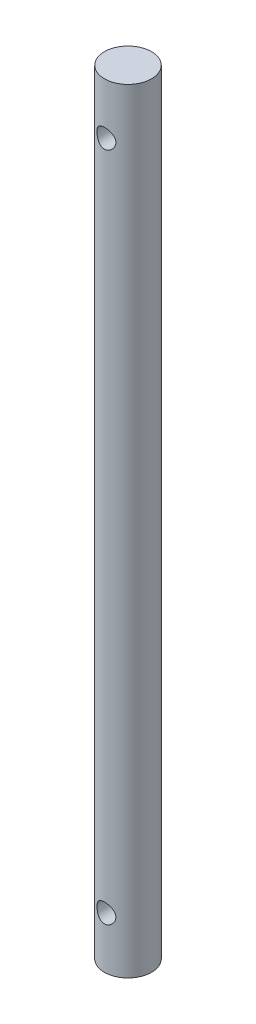
ISO-10303-21;
HEADER;
FILE_DESCRIPTION(('STEP AP214'),'2;1');
FILE_NAME('part.step','',(''),(''),'','','');
FILE_SCHEMA(('AUTOMOTIVE_DESIGN { 1 0 10303 214 1 1 1 1 }'));
ENDSEC;
DATA;
#1=APPLICATION_CONTEXT('core data for automotive mechanical design processes');
#2=APPLICATION_PROTOCOL_DEFINITION('international standard','automotive_design',2000,#1);
#3=PRODUCT_CONTEXT('',#1,'mechanical');
#4=PRODUCT('Part','Part','',(#3));
#5=PRODUCT_RELATED_PRODUCT_CATEGORY('part','',(#4));
#6=PRODUCT_DEFINITION_FORMATION('','',#4);
#7=PRODUCT_DEFINITION_CONTEXT('part definition',#1,'design');
#8=PRODUCT_DEFINITION('design','',#6,#7);
#9=PRODUCT_DEFINITION_SHAPE('','',#8);
#10=(LENGTH_UNIT() NAMED_UNIT(*) SI_UNIT(.MILLI.,.METRE.));
#11=(NAMED_UNIT(*) PLANE_ANGLE_UNIT() SI_UNIT($,.RADIAN.));
#12=(NAMED_UNIT(*) SI_UNIT($,.STERADIAN.) SOLID_ANGLE_UNIT());
#13=UNCERTAINTY_MEASURE_WITH_UNIT(LENGTH_MEASURE(1.E-05),#10,'distance_accuracy_value','');
#14=(GEOMETRIC_REPRESENTATION_CONTEXT(3) GLOBAL_UNCERTAINTY_ASSIGNED_CONTEXT((#13)) GLOBAL_UNIT_ASSIGNED_CONTEXT((#10,
#11,#12)) REPRESENTATION_CONTEXT('',''));
#15=CARTESIAN_POINT('',(0.,0.,0.));
#16=DIRECTION('',(0.,0.,1.));
#17=DIRECTION('',(1.,0.,0.));
#18=AXIS2_PLACEMENT_3D('',#15,#16,#17);
#19=CARTESIAN_POINT('',(0.,65.09,0.));
#20=DIRECTION('',(0.,-1.,0.));
#21=DIRECTION('',(0.,0.,-1.));
#22=AXIS2_PLACEMENT_3D('',#19,#20,#21);
#23=CYLINDRICAL_SURFACE('',#22,3.96);
#24=CARTESIAN_POINT('',(0.,58.02,-3.96));
#25=CARTESIAN_POINT('',(-0.0854312436325381,58.019992025033,-3.95999409172408));
#26=CARTESIAN_POINT('',(-0.171009566426885,58.0130735641593,-3.95720303708857));
#27=CARTESIAN_POINT('',(-0.339752792783413,57.9856398631795,-3.94631023386838));
#28=CARTESIAN_POINT('',(-0.422910519502968,57.9650877890048,-3.93819409911361));
#29=CARTESIAN_POINT('',(-0.584099444114652,57.9112561964,-3.91752553807651));
#30=CARTESIAN_POINT('',(-0.662146503104793,57.8780184787158,-3.90498769207319));
#31=CARTESIAN_POINT('',(-0.811485485023458,57.7999255873628,-3.87670934376557));
#32=CARTESIAN_POINT('',(-0.882779714464923,57.7550744001049,-3.86096994081656));
#33=CARTESIAN_POINT('',(-1.0200714781108,57.6527816382026,-3.82704452603687));
#34=CARTESIAN_POINT('',(-1.08570711965203,57.5948798441887,-3.80878219199709));
#35=CARTESIAN_POINT('',(-1.20664287587372,57.4691009866328,-3.77221586273226));
#36=CARTESIAN_POINT('',(-1.26193790039142,57.4012190395782,-3.75391185145518));
#37=CARTESIAN_POINT('',(-1.36306969491331,57.2537044101543,-3.71841985760219));
#38=CARTESIAN_POINT('',(-1.40837003993839,57.1736808630508,-3.70131893821813));
#39=CARTESIAN_POINT('',(-1.48470612668735,57.0063609178797,-3.67136783703444));
#40=CARTESIAN_POINT('',(-1.51574869497597,56.919068024046,-3.65851562180059));
#41=CARTESIAN_POINT('',(-1.56122167318534,56.7438462926132,-3.63933707896309));
#42=CARTESIAN_POINT('',(-1.57634523260308,56.6561280820495,-3.63273982388139));
#43=CARTESIAN_POINT('',(-1.59171584697393,56.4791699467331,-3.62603341880269));
#44=CARTESIAN_POINT('',(-1.59197029417087,56.3899308001947,-3.62592104481919));
#45=CARTESIAN_POINT('',(-1.57812046956369,56.219146496992,-3.63196614567175));
#46=CARTESIAN_POINT('',(-1.56502317808247,56.1375010814797,-3.63768392079308));
#47=CARTESIAN_POINT('',(-1.52652158572633,55.9776828510755,-3.65400662325502));
#48=CARTESIAN_POINT('',(-1.50111511926502,55.8995106498785,-3.6646124105408));
#49=CARTESIAN_POINT('',(-1.43823154522724,55.7469638572439,-3.68974965277596));
#50=CARTESIAN_POINT('',(-1.40051775207702,55.6726999143918,-3.7043570997677));
#51=CARTESIAN_POINT('',(-1.31425635567717,55.5312802946682,-3.73583117344958));
#52=CARTESIAN_POINT('',(-1.26570466419811,55.4641273142966,-3.75269865169747));
#53=CARTESIAN_POINT('',(-1.15469818714458,55.3333278744793,-3.78839332137411));
#54=CARTESIAN_POINT('',(-1.09145471692521,55.2703626695358,-3.80727078769127));
#55=CARTESIAN_POINT('',(-0.955106321970933,55.1557129449352,-3.84374142720701));
#56=CARTESIAN_POINT('',(-0.881999408277215,55.1040307060004,-3.86133434027042));
#57=CARTESIAN_POINT('',(-0.726054695745388,55.0125107091761,-3.89370041888039));
#58=CARTESIAN_POINT('',(-0.643051229377972,54.9729311121925,-3.90841000074766));
#59=CARTESIAN_POINT('',(-0.470823689417729,54.9085318851767,-3.93287067816593));
#60=CARTESIAN_POINT('',(-0.381602826870437,54.8837046982959,-3.94262431200497));
#61=CARTESIAN_POINT('',(-0.205181951129866,54.8508971324546,-3.95561046973272));
#62=CARTESIAN_POINT('',(-0.118178130229558,54.8420013446021,-3.9591968236783));
#63=CARTESIAN_POINT('',(0.0561447509033511,54.8386037660573,-3.96056023468678));
#64=CARTESIAN_POINT('',(0.143463722686201,54.8440982093446,-3.95833881168432));
#65=CARTESIAN_POINT('',(0.311776688751577,54.8686535997764,-3.94856768844801));
#66=CARTESIAN_POINT('',(0.392877945215572,54.8870880643155,-3.94126417127798));
#67=CARTESIAN_POINT('',(0.550760137857933,54.936146029501,-3.92231943736234));
#68=CARTESIAN_POINT('',(0.627540518322281,54.966771093927,-3.91067766412828));
#69=CARTESIAN_POINT('',(0.77724935783678,55.0403405691312,-3.88374155370206));
#70=CARTESIAN_POINT('',(0.849987696591288,55.0836337122056,-3.86834622611552));
#71=CARTESIAN_POINT('',(0.987423138726882,55.1809238540338,-3.83556975401489));
#72=CARTESIAN_POINT('',(1.05211698899502,55.2349251603082,-3.81818781155081));
#73=CARTESIAN_POINT('',(1.17614195894536,55.3563101924046,-3.78189637459643));
#74=CARTESIAN_POINT('',(1.23483018041225,55.4243451236288,-3.76296217553955));
#75=CARTESIAN_POINT('',(1.34011648876367,55.5696297824719,-3.72676743613199));
#76=CARTESIAN_POINT('',(1.38671251995656,55.6468810736325,-3.70950718066632));
#77=CARTESIAN_POINT('',(1.46680418211759,55.8096079188738,-3.6785807182313));
#78=CARTESIAN_POINT('',(1.5001631360796,55.8951584723045,-3.66495246228337));
#79=CARTESIAN_POINT('',(1.55174097838182,56.0713756378136,-3.64341816688347));
#80=CARTESIAN_POINT('',(1.56997115659847,56.1620383808538,-3.63550786097046));
#81=CARTESIAN_POINT('',(1.58969165930686,56.3388307267036,-3.62692505662655));
#82=CARTESIAN_POINT('',(1.59229874657574,56.4248130797111,-3.62576985121696));
#83=CARTESIAN_POINT('',(1.58363602102753,56.5959300465178,-3.6295618677272));
#84=CARTESIAN_POINT('',(1.57236800062636,56.6810647683836,-3.63450830142446));
#85=CARTESIAN_POINT('',(1.53718935530539,56.8445659102567,-3.64951905553429));
#86=CARTESIAN_POINT('',(1.51380447273074,56.9230668386092,-3.65936992820412));
#87=CARTESIAN_POINT('',(1.45554973408757,57.0750612722897,-3.682927777119));
#88=CARTESIAN_POINT('',(1.42067670095013,57.1485533856277,-3.69663581991833));
#89=CARTESIAN_POINT('',(1.33811819131313,57.293051018305,-3.72734263685481));
#90=CARTESIAN_POINT('',(1.28981103398286,57.3636702466382,-3.74448535729744));
#91=CARTESIAN_POINT('',(1.18266085686363,57.496150433226,-3.77969451476588));
#92=CARTESIAN_POINT('',(1.12381461759375,57.5580087048121,-3.79776123284642));
#93=CARTESIAN_POINT('',(0.992666920972371,57.6753721495081,-3.83420598645991));
#94=CARTESIAN_POINT('',(0.919736394022115,57.7301952587485,-3.85252682455425));
#95=CARTESIAN_POINT('',(0.765017524570699,57.8268409347584,-3.88620719499887));
#96=CARTESIAN_POINT('',(0.683225096276019,57.8686574701399,-3.90156535224942));
#97=CARTESIAN_POINT('',(0.514584606819031,57.9371284351909,-3.92733331338059));
#98=CARTESIAN_POINT('',(0.427857759377116,57.964048531392,-3.9378292379452));
#99=CARTESIAN_POINT('',(0.25076512452607,58.0026975538503,-3.9530434204857));
#100=CARTESIAN_POINT('',(0.160411818463733,58.0144746322737,-3.95777998958768));
#101=CARTESIAN_POINT('',(0.0465699177516872,58.0194907424783,-3.95979622191286));
#102=CARTESIAN_POINT('',(0.0232904245344727,58.0200021741503,-3.96000161072517));
#103=CARTESIAN_POINT('',(0.,58.02,-3.96));
#104=B_SPLINE_CURVE_WITH_KNOTS('',3,(#24,#25,#26,#27,#28,#29,#30,#31,#32,#33,#34,#35,#36,#37,
#38,#39,#40,#41,#42,#43,#44,#45,#46,#47,#48,#49,#50,#51,#52,#53,#54,#55,#56,#57,#58,#59,#60,#61,
#62,#63,#64,#65,#66,#67,#68,#69,#70,#71,#72,#73,#74,#75,#76,#77,#78,#79,#80,#81,#82,#83,#84,#85,
#86,#87,#88,#89,#90,#91,#92,#93,#94,#95,#96,#97,#98,#99,#100,#101,#102,#103),.UNSPECIFIED.,.T.,
.F.,(4,2,2,2,2,2,2,2,2,2,2,2,2,2,2,2,2,2,2,2,2,2,2,2,2,2,2,2,2,2,2,2,2,2,2,2,2,2,2,4),(0.,
0.256231140189331,0.513157377427788,0.769244220124074,1.02524327534304,1.29230201007723,
1.55949186026509,1.83868361055381,2.11774154527388,2.38407071723505,2.65026748136253,
2.89777254590575,3.14532117050418,3.39794262283324,3.65065952955054,3.923073659252,
4.19554280346823,4.47347304846089,4.75126080206307,5.01250182072127,5.27367447767637,
5.5230040379708,5.77236559195324,6.02936802878935,6.2864740592384,6.5606810322328,
6.83493459035823,7.11195048564655,7.3887594709515,7.64552050473718,7.90224837306562,
8.1486690444067,8.39515792112244,8.65582731056964,8.91657646560165,9.19441458130436,
9.47238134423982,9.74521635192218,10.0171816285484,10.0870358385565),.UNSPECIFIED.);
#105=CARTESIAN_POINT('',(0.,58.02,-3.96));
#106=VERTEX_POINT('',#105);
#107=EDGE_CURVE('E49',#106,#106,#104,.T.);
#108=ORIENTED_EDGE('',*,*,#107,.T.);
#109=EDGE_LOOP('',(#108));
#110=FACE_BOUND('',#109,.T.);
#111=CARTESIAN_POINT('',(1.59,56.43,3.62677542729075));
#112=CARTESIAN_POINT('',(1.58999195078685,56.3448836991205,3.62678298759535));
#113=CARTESIAN_POINT('',(1.58312219250491,56.2596163126124,3.62981507705667));
#114=CARTESIAN_POINT('',(1.55590022664081,56.0915237518945,3.64156293360954));
#115=CARTESIAN_POINT('',(1.53551023960798,56.0087061022851,3.65029462598056));
#116=CARTESIAN_POINT('',(1.48215152891577,55.8482397695235,3.6722812537767));
#117=CARTESIAN_POINT('',(1.44923159281701,55.7705723930677,3.68551862467545));
#118=CARTESIAN_POINT('',(1.37188989980722,55.6218876516628,3.71499983925612));
#119=CARTESIAN_POINT('',(1.32747143757207,55.5508683897516,3.73124282135984));
#120=CARTESIAN_POINT('',(1.22565191327523,55.413352087321,3.76595452485308));
#121=CARTESIAN_POINT('',(1.16769340941828,55.3472857444371,3.78449521993051));
#122=CARTESIAN_POINT('',(1.0416113765069,55.2254949033661,3.82111930885842));
#123=CARTESIAN_POINT('',(0.973484104794366,55.1697742299618,3.83920253145625));
#124=CARTESIAN_POINT('',(0.825668950713796,55.0681159104682,3.87373830208315));
#125=CARTESIAN_POINT('',(0.74562904007728,55.0226555042832,3.89009738856802));
#126=CARTESIAN_POINT('',(0.578263574542512,54.9460284713871,3.91846895609392));
#127=CARTESIAN_POINT('',(0.490941053207268,54.9148559278861,3.93048323594027));
#128=CARTESIAN_POINT('',(0.316003617767931,54.869227834353,3.94830218011608));
#129=CARTESIAN_POINT('',(0.228610380252791,54.8540315774747,3.95438095044113));
#130=CARTESIAN_POINT('',(0.0523170355787117,54.8384015657415,3.96063514526383));
#131=CARTESIAN_POINT('',(-0.0365824935813495,54.8379622711463,3.96081278503627));
#132=CARTESIAN_POINT('',(-0.208007720908716,54.8514541926005,3.95541101049953));
#133=CARTESIAN_POINT('',(-0.290609423787398,54.8645736036623,3.95015681283276));
#134=CARTESIAN_POINT('',(-0.45232424868461,54.9034287316185,3.93492083798518));
#135=CARTESIAN_POINT('',(-0.531437114289664,54.9291653741426,3.92493871395443));
#136=CARTESIAN_POINT('',(-0.685356914161423,54.9928397420274,3.90103175818298));
#137=CARTESIAN_POINT('',(-0.760080831602969,55.0309557651151,3.88704969002319));
#138=CARTESIAN_POINT('',(-0.902265063681879,55.1181391962909,3.85652869017187));
#139=CARTESIAN_POINT('',(-0.969722869177601,55.167210369564,3.83998888000983));
#140=CARTESIAN_POINT('',(-1.10019371649987,55.2786903505805,3.804738993193));
#141=CARTESIAN_POINT('',(-1.16261832431589,55.3417663213104,3.78595772770334));
#142=CARTESIAN_POINT('',(-1.27624601729864,55.4775620429016,3.74918266451347));
#143=CARTESIAN_POINT('',(-1.32744537260277,55.5502849863598,3.73118913014062));
#144=CARTESIAN_POINT('',(-1.41852965971939,55.705960878874,3.69754046729277));
#145=CARTESIAN_POINT('',(-1.45804845557621,55.7891472045952,3.68196709232658));
#146=CARTESIAN_POINT('',(-1.52228214928927,55.9617858441893,3.65588201320998));
#147=CARTESIAN_POINT('',(-1.54700674892019,56.0512340085676,3.6453669927683));
#148=CARTESIAN_POINT('',(-1.57951296663874,56.2279847761902,3.63139570717007));
#149=CARTESIAN_POINT('',(-1.58824227796941,56.3150815162165,3.62754542476669));
#150=CARTESIAN_POINT('',(-1.59127586215782,56.4895614608864,3.62621666083514));
#151=CARTESIAN_POINT('',(-1.58558456180527,56.5769445693972,3.62873622391322));
#152=CARTESIAN_POINT('',(-1.56080153217723,56.7442264516949,3.63945863715613));
#153=CARTESIAN_POINT('',(-1.5425001671102,56.824266477251,3.64732593338939));
#154=CARTESIAN_POINT('',(-1.49404381769741,56.9800854856913,3.6674399981933));
#155=CARTESIAN_POINT('',(-1.46388619200505,57.0558635147818,3.67968774258854));
#156=CARTESIAN_POINT('',(-1.39120293990302,57.2044497022671,3.70779274404468));
#157=CARTESIAN_POINT('',(-1.3482236341883,57.2770112239548,3.72377668785942));
#158=CARTESIAN_POINT('',(-1.25157971766847,57.414224024757,3.7573610951886));
#159=CARTESIAN_POINT('',(-1.19791073103539,57.4788720469197,3.77496221910202));
#160=CARTESIAN_POINT('',(-1.07668918121796,57.6034316585069,3.81138175144335));
#161=CARTESIAN_POINT('',(-1.00839997921708,57.6626311103257,3.83019311186344));
#162=CARTESIAN_POINT('',(-0.862408571448087,57.7688422740752,3.86568080642493));
#163=CARTESIAN_POINT('',(-0.784705953968486,57.8158534526488,3.88235704711762));
#164=CARTESIAN_POINT('',(-0.621796205927506,57.8961899681781,3.91175301589417));
#165=CARTESIAN_POINT('',(-0.536589132941812,57.9295154101224,3.92447277432956));
#166=CARTESIAN_POINT('',(-0.361141335505479,57.981136982049,3.94448395625395));
#167=CARTESIAN_POINT('',(-0.270903398374161,57.9994413477079,3.95177835412537));
#168=CARTESIAN_POINT('',(-0.0943465402302836,58.01951866011,3.95979718360758));
#169=CARTESIAN_POINT('',(-0.00815938553605542,58.0222982378463,3.96092158806393));
#170=CARTESIAN_POINT('',(0.163412317398946,58.0139096470454,3.9575565819137));
#171=CARTESIAN_POINT('',(0.248796987211363,58.0027436266517,3.95306803591116));
#172=CARTESIAN_POINT('',(0.413613134601732,57.9675006707753,3.93918253154566));
#173=CARTESIAN_POINT('',(0.493147195417048,57.9438365727284,3.92994275990294));
#174=CARTESIAN_POINT('',(0.647101138369533,57.8847041022224,3.90754623467457));
#175=CARTESIAN_POINT('',(0.721520011998115,57.8492334099876,3.89438871137733));
#176=CARTESIAN_POINT('',(0.866756555331419,57.7657240950058,3.864721299715));
#177=CARTESIAN_POINT('',(0.937268332309587,57.7171980344492,3.84808865595822));
#178=CARTESIAN_POINT('',(1.06943963801552,57.6096872740417,3.813472746772));
#179=CARTESIAN_POINT('',(1.13109617697811,57.5506990568396,3.7954890282903));
#180=CARTESIAN_POINT('',(1.24778992956168,57.4195921091038,3.75880212876852));
#181=CARTESIAN_POINT('',(1.30217553401349,57.346884330995,3.74012391654668));
#182=CARTESIAN_POINT('',(1.39804531442304,57.1927606807914,3.70535843178243));
#183=CARTESIAN_POINT('',(1.4395225223093,57.1113401372217,3.68927256086084));
#184=CARTESIAN_POINT('',(1.50779852377964,56.9426863664309,3.66189731992592));
#185=CARTESIAN_POINT('',(1.53472919862279,56.8555136915351,3.65056507026092));
#186=CARTESIAN_POINT('',(1.57324752767344,56.6774506212119,3.63413674472207));
#187=CARTESIAN_POINT('',(1.58488666518809,56.5865737681358,3.62901974784891));
#188=CARTESIAN_POINT('',(1.58955231843662,56.4736723718772,3.62697069883915));
#189=CARTESIAN_POINT('',(1.5900020654581,56.4518411600909,3.62677348728841));
#190=CARTESIAN_POINT('',(1.59,56.43,3.62677542729075));
#191=B_SPLINE_CURVE_WITH_KNOTS('',3,(#111,#112,#113,#114,#115,#116,#117,#118,#119,#120,#121,
#122,#123,#124,#125,#126,#127,#128,#129,#130,#131,#132,#133,#134,#135,#136,#137,#138,#139,#140,
#141,#142,#143,#144,#145,#146,#147,#148,#149,#150,#151,#152,#153,#154,#155,#156,#157,#158,#159,
#160,#161,#162,#163,#164,#165,#166,#167,#168,#169,#170,#171,#172,#173,#174,#175,#176,#177,#178,
#179,#180,#181,#182,#183,#184,#185,#186,#187,#188,#189,#190),.UNSPECIFIED.,.T.,.F.,(4,2,2,2,2,2,
2,2,2,2,2,2,2,2,2,2,2,2,2,2,2,2,2,2,2,2,2,2,2,2,2,2,2,2,2,2,2,2,2,4),(0.,0.255290060611476,
0.511296499083921,0.766316163095071,1.02126283697459,1.28954166836763,1.55791948551856,
1.83697140859004,2.11590766798773,2.38124911057845,2.64649094329843,2.8967230259443,
3.14697346895015,3.40100115122495,3.65511627527115,3.92602646568736,4.19702653662425,
4.4757898492809,4.75437015291681,5.0158335070881,5.27721660786416,5.52355116179761,
5.7699406254532,6.02636454041952,6.28289363921607,6.55854237922545,6.83420317954946,
7.1098618651328,7.38536931285348,7.64278513845774,7.90016131729304,8.14952348564654,
8.39893467796963,8.6594024442466,8.91995794571119,9.19674456629126,9.47368034071757,
9.74806133040632,10.021516150881,10.0870245320703),.UNSPECIFIED.);
#192=CARTESIAN_POINT('',(1.59,56.43,3.62677542729075));
#193=VERTEX_POINT('',#192);
#194=EDGE_CURVE('E53',#193,#193,#191,.T.);
#195=ORIENTED_EDGE('',*,*,#194,.T.);
#196=EDGE_LOOP('',(#195));
#197=FACE_BOUND('',#196,.T.);
#198=CARTESIAN_POINT('',(0.,65.09,0.));
#199=DIRECTION('',(0.,1.,0.));
#200=DIRECTION('',(0.,0.,1.));
#201=AXIS2_PLACEMENT_3D('',#198,#199,#200);
#202=CIRCLE('',#201,3.96);
#203=CARTESIAN_POINT('',(0.,65.09,3.96));
#204=VERTEX_POINT('',#203);
#205=EDGE_CURVE('E80',#204,#204,#202,.T.);
#206=ORIENTED_EDGE('',*,*,#205,.F.);
#207=EDGE_LOOP('',(#206));
#208=FACE_BOUND('',#207,.T.);
#209=CARTESIAN_POINT('',(0.,-65.09,0.));
#210=DIRECTION('',(0.,1.,0.));
#211=DIRECTION('',(0.,0.,1.));
#212=AXIS2_PLACEMENT_3D('',#209,#210,#211);
#213=CIRCLE('',#212,3.96);
#214=CARTESIAN_POINT('',(0.,-65.09,3.96));
#215=VERTEX_POINT('',#214);
#216=EDGE_CURVE('E81',#215,#215,#213,.T.);
#217=ORIENTED_EDGE('',*,*,#216,.T.);
#218=EDGE_LOOP('',(#217));
#219=FACE_BOUND('',#218,.T.);
#220=CARTESIAN_POINT('',(1.59,-56.43,3.62677542729075));
#221=CARTESIAN_POINT('',(1.58999195078685,-56.3448836991205,3.62678298759535));
#222=CARTESIAN_POINT('',(1.58312219250491,-56.2596163126124,3.62981507705667));
#223=CARTESIAN_POINT('',(1.55590022664081,-56.0915237518945,3.64156293360954));
#224=CARTESIAN_POINT('',(1.53551023960798,-56.0087061022851,3.65029462598056));
#225=CARTESIAN_POINT('',(1.48215152891577,-55.8482397695235,3.6722812537767));
#226=CARTESIAN_POINT('',(1.44923159281701,-55.7705723930677,3.68551862467545));
#227=CARTESIAN_POINT('',(1.37188989980722,-55.6218876516628,3.71499983925612));
#228=CARTESIAN_POINT('',(1.32747143757207,-55.5508683897516,3.73124282135984));
#229=CARTESIAN_POINT('',(1.22565191327523,-55.413352087321,3.76595452485308));
#230=CARTESIAN_POINT('',(1.16769340941828,-55.3472857444371,3.78449521993051));
#231=CARTESIAN_POINT('',(1.0416113765069,-55.2254949033661,3.82111930885842));
#232=CARTESIAN_POINT('',(0.973484104794366,-55.1697742299618,3.83920253145625));
#233=CARTESIAN_POINT('',(0.825668950713796,-55.0681159104682,3.87373830208315));
#234=CARTESIAN_POINT('',(0.74562904007728,-55.0226555042832,3.89009738856802));
#235=CARTESIAN_POINT('',(0.578263574542512,-54.9460284713871,3.91846895609392));
#236=CARTESIAN_POINT('',(0.490941053207268,-54.9148559278861,3.93048323594027));
#237=CARTESIAN_POINT('',(0.316003617767931,-54.869227834353,3.94830218011608));
#238=CARTESIAN_POINT('',(0.228610380252791,-54.8540315774747,3.95438095044113));
#239=CARTESIAN_POINT('',(0.0523170355787117,-54.8384015657415,3.96063514526383));
#240=CARTESIAN_POINT('',(-0.0365824935813495,-54.8379622711463,3.96081278503627));
#241=CARTESIAN_POINT('',(-0.208007720908716,-54.8514541926005,3.95541101049953));
#242=CARTESIAN_POINT('',(-0.290609423787398,-54.8645736036623,3.95015681283276));
#243=CARTESIAN_POINT('',(-0.45232424868461,-54.9034287316185,3.93492083798518));
#244=CARTESIAN_POINT('',(-0.531437114289664,-54.9291653741426,3.92493871395443));
#245=CARTESIAN_POINT('',(-0.685356914161423,-54.9928397420274,3.90103175818298));
#246=CARTESIAN_POINT('',(-0.760080831602969,-55.0309557651151,3.88704969002319));
#247=CARTESIAN_POINT('',(-0.902265063681879,-55.1181391962909,3.85652869017187));
#248=CARTESIAN_POINT('',(-0.969722869177601,-55.167210369564,3.83998888000983));
#249=CARTESIAN_POINT('',(-1.10019371649987,-55.2786903505805,3.804738993193));
#250=CARTESIAN_POINT('',(-1.16261832431589,-55.3417663213104,3.78595772770334));
#251=CARTESIAN_POINT('',(-1.27624601729864,-55.4775620429016,3.74918266451347));
#252=CARTESIAN_POINT('',(-1.32744537260277,-55.5502849863598,3.73118913014062));
#253=CARTESIAN_POINT('',(-1.41852965971939,-55.705960878874,3.69754046729277));
#254=CARTESIAN_POINT('',(-1.45804845557621,-55.7891472045952,3.68196709232658));
#255=CARTESIAN_POINT('',(-1.52228214928927,-55.9617858441893,3.65588201320998));
#256=CARTESIAN_POINT('',(-1.54700674892019,-56.0512340085676,3.6453669927683));
#257=CARTESIAN_POINT('',(-1.57951296663874,-56.2279847761902,3.63139570717007));
#258=CARTESIAN_POINT('',(-1.58824227796941,-56.3150815162165,3.62754542476669));
#259=CARTESIAN_POINT('',(-1.59127586215782,-56.4895614608864,3.62621666083514));
#260=CARTESIAN_POINT('',(-1.58558456180527,-56.5769445693972,3.62873622391322));
#261=CARTESIAN_POINT('',(-1.56080153217723,-56.7442264516949,3.63945863715613));
#262=CARTESIAN_POINT('',(-1.5425001671102,-56.824266477251,3.64732593338939));
#263=CARTESIAN_POINT('',(-1.49404381769741,-56.9800854856913,3.6674399981933));
#264=CARTESIAN_POINT('',(-1.46388619200505,-57.0558635147818,3.67968774258854));
#265=CARTESIAN_POINT('',(-1.39120293990302,-57.2044497022671,3.70779274404468));
#266=CARTESIAN_POINT('',(-1.3482236341883,-57.2770112239548,3.72377668785942));
#267=CARTESIAN_POINT('',(-1.25157971766847,-57.414224024757,3.7573610951886));
#268=CARTESIAN_POINT('',(-1.19791073103539,-57.4788720469197,3.77496221910202));
#269=CARTESIAN_POINT('',(-1.07668918121796,-57.6034316585069,3.81138175144335));
#270=CARTESIAN_POINT('',(-1.00839997921708,-57.6626311103257,3.83019311186344));
#271=CARTESIAN_POINT('',(-0.862408571448087,-57.7688422740752,3.86568080642493));
#272=CARTESIAN_POINT('',(-0.784705953968486,-57.8158534526488,3.88235704711762));
#273=CARTESIAN_POINT('',(-0.621796205927506,-57.8961899681781,3.91175301589417));
#274=CARTESIAN_POINT('',(-0.536589132941812,-57.9295154101224,3.92447277432956));
#275=CARTESIAN_POINT('',(-0.361141335505479,-57.981136982049,3.94448395625395));
#276=CARTESIAN_POINT('',(-0.270903398374161,-57.9994413477079,3.95177835412537));
#277=CARTESIAN_POINT('',(-0.0943465402302836,-58.01951866011,3.95979718360758));
#278=CARTESIAN_POINT('',(-0.00815938553605542,-58.0222982378463,3.96092158806393));
#279=CARTESIAN_POINT('',(0.163412317398946,-58.0139096470454,3.9575565819137));
#280=CARTESIAN_POINT('',(0.248796987211363,-58.0027436266517,3.95306803591116));
#281=CARTESIAN_POINT('',(0.413613134601732,-57.9675006707753,3.93918253154566));
#282=CARTESIAN_POINT('',(0.493147195417048,-57.9438365727284,3.92994275990294));
#283=CARTESIAN_POINT('',(0.647101138369533,-57.8847041022224,3.90754623467457));
#284=CARTESIAN_POINT('',(0.721520011998115,-57.8492334099876,3.89438871137733));
#285=CARTESIAN_POINT('',(0.866756555331419,-57.7657240950058,3.864721299715));
#286=CARTESIAN_POINT('',(0.937268332309587,-57.7171980344492,3.84808865595822));
#287=CARTESIAN_POINT('',(1.06943963801552,-57.6096872740417,3.813472746772));
#288=CARTESIAN_POINT('',(1.13109617697811,-57.5506990568396,3.7954890282903));
#289=CARTESIAN_POINT('',(1.24778992956168,-57.4195921091038,3.75880212876852));
#290=CARTESIAN_POINT('',(1.30217553401349,-57.346884330995,3.74012391654668));
#291=CARTESIAN_POINT('',(1.39804531442304,-57.1927606807914,3.70535843178243));
#292=CARTESIAN_POINT('',(1.4395225223093,-57.1113401372217,3.68927256086084));
#293=CARTESIAN_POINT('',(1.50779852377964,-56.9426863664309,3.66189731992592));
#294=CARTESIAN_POINT('',(1.53472919862279,-56.8555136915351,3.65056507026092));
#295=CARTESIAN_POINT('',(1.57324752767344,-56.6774506212119,3.63413674472207));
#296=CARTESIAN_POINT('',(1.58488666518809,-56.5865737681358,3.62901974784891));
#297=CARTESIAN_POINT('',(1.58955231843662,-56.4736723718772,3.62697069883915));
#298=CARTESIAN_POINT('',(1.5900020654581,-56.4518411600909,3.62677348728841));
#299=CARTESIAN_POINT('',(1.59,-56.43,3.62677542729075));
#300=B_SPLINE_CURVE_WITH_KNOTS('',3,(#220,#221,#222,#223,#224,#225,#226,#227,#228,#229,#230,
#231,#232,#233,#234,#235,#236,#237,#238,#239,#240,#241,#242,#243,#244,#245,#246,#247,#248,#249,
#250,#251,#252,#253,#254,#255,#256,#257,#258,#259,#260,#261,#262,#263,#264,#265,#266,#267,#268,
#269,#270,#271,#272,#273,#274,#275,#276,#277,#278,#279,#280,#281,#282,#283,#284,#285,#286,#287,
#288,#289,#290,#291,#292,#293,#294,#295,#296,#297,#298,#299),.UNSPECIFIED.,.T.,.F.,(4,2,2,2,2,2,
2,2,2,2,2,2,2,2,2,2,2,2,2,2,2,2,2,2,2,2,2,2,2,2,2,2,2,2,2,2,2,2,2,4),(0.,0.255290060611476,
0.511296499083921,0.766316163095071,1.02126283697459,1.28954166836763,1.55791948551856,
1.83697140859004,2.11590766798773,2.38124911057845,2.64649094329843,2.8967230259443,
3.14697346895015,3.40100115122495,3.65511627527115,3.92602646568736,4.19702653662425,
4.4757898492809,4.75437015291681,5.0158335070881,5.27721660786416,5.52355116179761,
5.7699406254532,6.02636454041952,6.28289363921607,6.55854237922545,6.83420317954946,
7.1098618651328,7.38536931285348,7.64278513845774,7.90016131729304,8.14952348564654,
8.39893467796963,8.6594024442466,8.91995794571119,9.19674456629126,9.47368034071757,
9.74806133040632,10.021516150881,10.0870245320703),.UNSPECIFIED.);
#301=CARTESIAN_POINT('',(1.59,-56.43,3.62677542729075));
#302=VERTEX_POINT('',#301);
#303=EDGE_CURVE('E45',#302,#302,#300,.T.);
#304=ORIENTED_EDGE('',*,*,#303,.F.);
#305=EDGE_LOOP('',(#304));
#306=FACE_BOUND('',#305,.T.);
#307=CARTESIAN_POINT('',(0.,-54.84,-3.96));
#308=CARTESIAN_POINT('',(0.0854312436325381,-54.840007974967,-3.95999409172408));
#309=CARTESIAN_POINT('',(0.171009566426885,-54.8469264358407,-3.95720303708857));
#310=CARTESIAN_POINT('',(0.339752792783413,-54.8743601368205,-3.94631023386838));
#311=CARTESIAN_POINT('',(0.422910519502968,-54.8949122109952,-3.93819409911361));
#312=CARTESIAN_POINT('',(0.584099444114652,-54.9487438036,-3.91752553807651));
#313=CARTESIAN_POINT('',(0.662146503104793,-54.9819815212842,-3.90498769207319));
#314=CARTESIAN_POINT('',(0.811485485023458,-55.0600744126372,-3.87670934376557));
#315=CARTESIAN_POINT('',(0.882779714464922,-55.1049255998951,-3.86096994081656));
#316=CARTESIAN_POINT('',(1.0200714781108,-55.2072183617974,-3.82704452603687));
#317=CARTESIAN_POINT('',(1.08570711965202,-55.2651201558113,-3.80878219199709));
#318=CARTESIAN_POINT('',(1.20664287587372,-55.3908990133672,-3.77221586273226));
#319=CARTESIAN_POINT('',(1.26193790039142,-55.4587809604219,-3.75391185145518));
#320=CARTESIAN_POINT('',(1.36306969491331,-55.6062955898457,-3.71841985760219));
#321=CARTESIAN_POINT('',(1.40837003993839,-55.6863191369492,-3.70131893821813));
#322=CARTESIAN_POINT('',(1.48470612668735,-55.8536390821203,-3.67136783703444));
#323=CARTESIAN_POINT('',(1.51574869497597,-55.940931975954,-3.65851562180059));
#324=CARTESIAN_POINT('',(1.56122167318534,-56.1161537073868,-3.63933707896309));
#325=CARTESIAN_POINT('',(1.57634523260308,-56.2038719179505,-3.63273982388139));
#326=CARTESIAN_POINT('',(1.59171584697393,-56.3808300532669,-3.62603341880269));
#327=CARTESIAN_POINT('',(1.59197029417087,-56.4700691998054,-3.62592104481919));
#328=CARTESIAN_POINT('',(1.57812046956369,-56.640853503008,-3.63196614567175));
#329=CARTESIAN_POINT('',(1.56502317808247,-56.7224989185203,-3.63768392079308));
#330=CARTESIAN_POINT('',(1.52652158572633,-56.8823171489245,-3.65400662325502));
#331=CARTESIAN_POINT('',(1.50111511926502,-56.9604893501215,-3.6646124105408));
#332=CARTESIAN_POINT('',(1.43823154522724,-57.1130361427561,-3.68974965277596));
#333=CARTESIAN_POINT('',(1.40051775207702,-57.1873000856082,-3.7043570997677));
#334=CARTESIAN_POINT('',(1.31425635567717,-57.3287197053318,-3.73583117344958));
#335=CARTESIAN_POINT('',(1.26570466419811,-57.3958726857034,-3.75269865169747));
#336=CARTESIAN_POINT('',(1.15469818714458,-57.5266721255207,-3.78839332137411));
#337=CARTESIAN_POINT('',(1.09145471692521,-57.5896373304642,-3.80727078769127));
#338=CARTESIAN_POINT('',(0.955106321970933,-57.7042870550648,-3.84374142720701));
#339=CARTESIAN_POINT('',(0.881999408277215,-57.7559692939996,-3.86133434027042));
#340=CARTESIAN_POINT('',(0.726054695745388,-57.847489290824,-3.89370041888039));
#341=CARTESIAN_POINT('',(0.643051229377972,-57.8870688878075,-3.90841000074766));
#342=CARTESIAN_POINT('',(0.470823689417729,-57.9514681148233,-3.93287067816593));
#343=CARTESIAN_POINT('',(0.381602826870437,-57.9762953017041,-3.94262431200497));
#344=CARTESIAN_POINT('',(0.205181951129866,-58.0091028675455,-3.95561046973272));
#345=CARTESIAN_POINT('',(0.118178130229558,-58.017998655398,-3.9591968236783));
#346=CARTESIAN_POINT('',(-0.0561447509033514,-58.0213962339427,-3.96056023468678));
#347=CARTESIAN_POINT('',(-0.143463722686201,-58.0159017906555,-3.95833881168432));
#348=CARTESIAN_POINT('',(-0.311776688751577,-57.9913464002237,-3.94856768844801));
#349=CARTESIAN_POINT('',(-0.392877945215572,-57.9729119356845,-3.94126417127798));
#350=CARTESIAN_POINT('',(-0.550760137857933,-57.9238539704991,-3.92231943736234));
#351=CARTESIAN_POINT('',(-0.62754051832228,-57.893228906073,-3.91067766412828));
#352=CARTESIAN_POINT('',(-0.777249357836777,-57.8196594308688,-3.88374155370206));
#353=CARTESIAN_POINT('',(-0.849987696591284,-57.7763662877944,-3.86834622611552));
#354=CARTESIAN_POINT('',(-0.987423138726878,-57.6790761459662,-3.83556975401489));
#355=CARTESIAN_POINT('',(-1.05211698899501,-57.6250748396918,-3.81818781155082));
#356=CARTESIAN_POINT('',(-1.17614195894536,-57.5036898075954,-3.78189637459643));
#357=CARTESIAN_POINT('',(-1.23483018041225,-57.4356548763712,-3.76296217553955));
#358=CARTESIAN_POINT('',(-1.34011648876367,-57.2903702175281,-3.72676743613199));
#359=CARTESIAN_POINT('',(-1.38671251995656,-57.2131189263675,-3.70950718066632));
#360=CARTESIAN_POINT('',(-1.46680418211759,-57.0503920811262,-3.6785807182313));
#361=CARTESIAN_POINT('',(-1.5001631360796,-56.9648415276956,-3.66495246228337));
#362=CARTESIAN_POINT('',(-1.55174097838182,-56.7886243621864,-3.64341816688347));
#363=CARTESIAN_POINT('',(-1.56997115659847,-56.6979616191462,-3.63550786097046));
#364=CARTESIAN_POINT('',(-1.58969165930686,-56.5211692732964,-3.62692505662655));
#365=CARTESIAN_POINT('',(-1.59229874657574,-56.4351869202889,-3.62576985121696));
#366=CARTESIAN_POINT('',(-1.58363602102753,-56.2640699534822,-3.6295618677272));
#367=CARTESIAN_POINT('',(-1.57236800062636,-56.1789352316164,-3.63450830142446));
#368=CARTESIAN_POINT('',(-1.53718935530539,-56.0154340897433,-3.64951905553429));
#369=CARTESIAN_POINT('',(-1.51380447273074,-55.9369331613909,-3.65936992820412));
#370=CARTESIAN_POINT('',(-1.45554973408757,-55.7849387277103,-3.682927777119));
#371=CARTESIAN_POINT('',(-1.42067670095013,-55.7114466143723,-3.69663581991833));
#372=CARTESIAN_POINT('',(-1.33811819131313,-55.566948981695,-3.72734263685481));
#373=CARTESIAN_POINT('',(-1.28981103398286,-55.4963297533618,-3.74448535729744));
#374=CARTESIAN_POINT('',(-1.18266085686363,-55.363849566774,-3.77969451476588));
#375=CARTESIAN_POINT('',(-1.12381461759375,-55.3019912951879,-3.79776123284642));
#376=CARTESIAN_POINT('',(-0.992666920972371,-55.1846278504919,-3.83420598645991));
#377=CARTESIAN_POINT('',(-0.919736394022115,-55.1298047412515,-3.85252682455425));
#378=CARTESIAN_POINT('',(-0.765017524570699,-55.0331590652416,-3.88620719499887));
#379=CARTESIAN_POINT('',(-0.683225096276019,-54.9913425298601,-3.90156535224942));
#380=CARTESIAN_POINT('',(-0.51458460681903,-54.9228715648091,-3.92733331338059));
#381=CARTESIAN_POINT('',(-0.427857759377114,-54.895951468608,-3.9378292379452));
#382=CARTESIAN_POINT('',(-0.250765124526068,-54.8573024461497,-3.9530434204857));
#383=CARTESIAN_POINT('',(-0.160411818463732,-54.8455253677263,-3.95777998958768));
#384=CARTESIAN_POINT('',(-0.0465699177516873,-54.8405092575217,-3.95979622191286));
#385=CARTESIAN_POINT('',(-0.0232904245344727,-54.8399978258497,-3.96000161072517));
#386=CARTESIAN_POINT('',(0.,-54.84,-3.96));
#387=B_SPLINE_CURVE_WITH_KNOTS('',3,(#307,#308,#309,#310,#311,#312,#313,#314,#315,#316,#317,
#318,#319,#320,#321,#322,#323,#324,#325,#326,#327,#328,#329,#330,#331,#332,#333,#334,#335,#336,
#337,#338,#339,#340,#341,#342,#343,#344,#345,#346,#347,#348,#349,#350,#351,#352,#353,#354,#355,
#356,#357,#358,#359,#360,#361,#362,#363,#364,#365,#366,#367,#368,#369,#370,#371,#372,#373,#374,
#375,#376,#377,#378,#379,#380,#381,#382,#383,#384,#385,#386),.UNSPECIFIED.,.T.,.F.,(4,2,2,2,2,2,
2,2,2,2,2,2,2,2,2,2,2,2,2,2,2,2,2,2,2,2,2,2,2,2,2,2,2,2,2,2,2,2,2,4),(0.,0.256231140189331,
0.513157377427788,0.769244220124074,1.02524327534304,1.29230201007723,1.55949186026509,
1.83868361055381,2.11774154527388,2.38407071723505,2.65026748136253,2.89777254590575,
3.14532117050418,3.39794262283324,3.65065952955054,3.923073659252,4.19554280346823,
4.47347304846089,4.75126080206307,5.01250182072128,5.27367447767637,5.5230040379708,
5.77236559195324,6.02936802878934,6.2864740592384,6.56068103223281,6.83493459035823,
7.11195048564655,7.3887594709515,7.64552050473718,7.90224837306562,8.1486690444067,
8.39515792112244,8.65582731056964,8.91657646560165,9.19441458130436,9.47238134423982,
9.74521635192219,10.0171816285484,10.0870358385565),.UNSPECIFIED.);
#388=CARTESIAN_POINT('',(0.,-54.84,-3.96));
#389=VERTEX_POINT('',#388);
#390=EDGE_CURVE('E10',#389,#389,#387,.T.);
#391=ORIENTED_EDGE('',*,*,#390,.F.);
#392=EDGE_LOOP('',(#391));
#393=FACE_BOUND('',#392,.T.);
#394=ADVANCED_FACE('F34',(#110,#197,#208,#219,#306,#393),#23,.T.);
#395=CARTESIAN_POINT('',(0.,65.09,0.));
#396=DIRECTION('',(0.,1.,0.));
#397=DIRECTION('',(0.,0.,1.));
#398=AXIS2_PLACEMENT_3D('',#395,#396,#397);
#399=PLANE('',#398);
#400=ORIENTED_EDGE('',*,*,#205,.T.);
#401=EDGE_LOOP('',(#400));
#402=FACE_BOUND('',#401,.T.);
#403=ADVANCED_FACE('F73',(#402),#399,.T.);
#404=CARTESIAN_POINT('',(0.,-65.09,0.));
#405=DIRECTION('',(0.,1.,0.));
#406=DIRECTION('',(0.,0.,1.));
#407=AXIS2_PLACEMENT_3D('',#404,#405,#406);
#408=PLANE('',#407);
#409=ORIENTED_EDGE('',*,*,#216,.F.);
#410=EDGE_LOOP('',(#409));
#411=FACE_BOUND('',#410,.T.);
#412=ADVANCED_FACE('F71',(#411),#408,.F.);
#413=CARTESIAN_POINT('',(0.,56.43,-3.96));
#414=DIRECTION('',(0.,0.,1.));
#415=DIRECTION('',(1.,0.,0.));
#416=AXIS2_PLACEMENT_3D('',#413,#414,#415);
#417=CYLINDRICAL_SURFACE('',#416,1.59);
#418=ORIENTED_EDGE('',*,*,#194,.F.);
#419=EDGE_LOOP('',(#418));
#420=FACE_BOUND('',#419,.T.);
#421=ORIENTED_EDGE('',*,*,#107,.F.);
#422=EDGE_LOOP('',(#421));
#423=FACE_BOUND('',#422,.T.);
#424=ADVANCED_FACE('F66',(#420,#423),#417,.F.);
#425=CARTESIAN_POINT('',(0.,-56.43,-3.96));
#426=DIRECTION('',(0.,0.,1.));
#427=DIRECTION('',(1.,0.,0.));
#428=AXIS2_PLACEMENT_3D('',#425,#426,#427);
#429=CYLINDRICAL_SURFACE('',#428,1.59);
#430=ORIENTED_EDGE('',*,*,#303,.T.);
#431=EDGE_LOOP('',(#430));
#432=FACE_BOUND('',#431,.T.);
#433=ORIENTED_EDGE('',*,*,#390,.T.);
#434=EDGE_LOOP('',(#433));
#435=FACE_BOUND('',#434,.T.);
#436=ADVANCED_FACE('F63',(#432,#435),#429,.F.);
#437=CLOSED_SHELL('',(#394,#403,#412,#424,#436));
#438=MANIFOLD_SOLID_BREP('B2',#437);
#439=ADVANCED_BREP_SHAPE_REPRESENTATION('',(#18,#438),#14);
#440=SHAPE_DEFINITION_REPRESENTATION(#9,#439);
ENDSEC;
END-ISO-10303-21;
